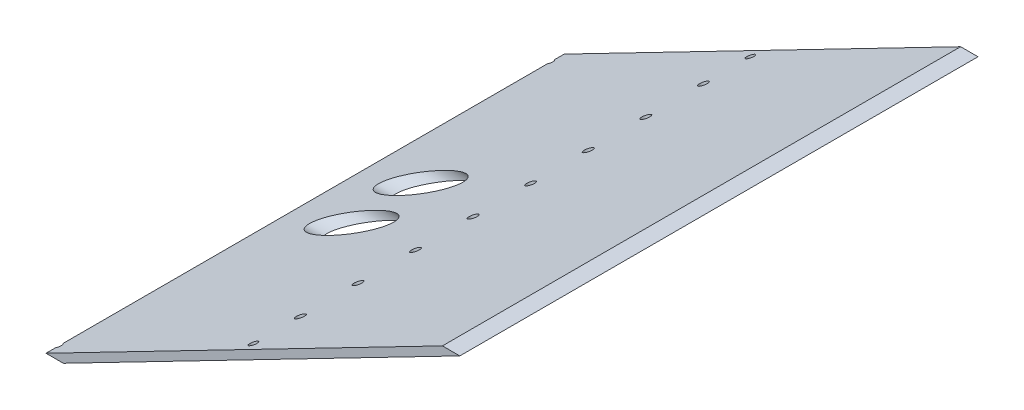
ISO-10303-21;
HEADER;
FILE_DESCRIPTION(('STEP AP214'),'2;1');
FILE_NAME('part.step','',(''),(''),'','','');
FILE_SCHEMA(('AUTOMOTIVE_DESIGN { 1 0 10303 214 1 1 1 1 }'));
ENDSEC;
DATA;
#1=APPLICATION_CONTEXT('core data for automotive mechanical design processes');
#2=APPLICATION_PROTOCOL_DEFINITION('international standard','automotive_design',2000,#1);
#3=PRODUCT_CONTEXT('',#1,'mechanical');
#4=PRODUCT('Part','Part','',(#3));
#5=PRODUCT_RELATED_PRODUCT_CATEGORY('part','',(#4));
#6=PRODUCT_DEFINITION_FORMATION('','',#4);
#7=PRODUCT_DEFINITION_CONTEXT('part definition',#1,'design');
#8=PRODUCT_DEFINITION('design','',#6,#7);
#9=PRODUCT_DEFINITION_SHAPE('','',#8);
#10=(LENGTH_UNIT() NAMED_UNIT(*) SI_UNIT(.MILLI.,.METRE.));
#11=(NAMED_UNIT(*) PLANE_ANGLE_UNIT() SI_UNIT($,.RADIAN.));
#12=(NAMED_UNIT(*) SI_UNIT($,.STERADIAN.) SOLID_ANGLE_UNIT());
#13=UNCERTAINTY_MEASURE_WITH_UNIT(LENGTH_MEASURE(1.E-05),#10,'distance_accuracy_value','');
#14=(GEOMETRIC_REPRESENTATION_CONTEXT(3) GLOBAL_UNCERTAINTY_ASSIGNED_CONTEXT((#13)) GLOBAL_UNIT_ASSIGNED_CONTEXT((#10,
#11,#12)) REPRESENTATION_CONTEXT('',''));
#15=CARTESIAN_POINT('',(0.,0.,0.));
#16=DIRECTION('',(0.,0.,1.));
#17=DIRECTION('',(1.,0.,0.));
#18=AXIS2_PLACEMENT_3D('',#15,#16,#17);
#19=CARTESIAN_POINT('',(5.,0.,5.));
#20=DIRECTION('',(0.,-1.,0.));
#21=DIRECTION('',(0.,0.,-1.));
#22=AXIS2_PLACEMENT_3D('',#19,#20,#21);
#23=CYLINDRICAL_SURFACE('',#22,1.6);
#24=CARTESIAN_POINT('',(5.,3.,5.));
#25=DIRECTION('',(0.,-1.,0.));
#26=DIRECTION('',(0.,0.,-1.));
#27=AXIS2_PLACEMENT_3D('',#24,#25,#26);
#28=CIRCLE('',#27,1.6);
#29=CARTESIAN_POINT('',(5.81249999999997,3.,6.3783481962117));
#30=VERTEX_POINT('',#29);
#31=CARTESIAN_POINT('',(5.81249999999997,3.,3.62165180378831));
#32=VERTEX_POINT('',#31);
#33=EDGE_CURVE('E115',#30,#32,#28,.F.);
#34=ORIENTED_EDGE('',*,*,#33,.F.);
#35=CARTESIAN_POINT('',(5.,2.58064516129034,5.));
#36=DIRECTION('',(0.458642919770252,-0.888620657054864,0.));
#37=DIRECTION('',(-0.888620657054864,-0.458642919770252,0.));
#38=AXIS2_PLACEMENT_3D('',#35,#36,#37);
#39=ELLIPSE('',#38,1.80054333342063,1.6);
#40=EDGE_CURVE('E102',#32,#30,#39,.T.);
#41=ORIENTED_EDGE('',*,*,#40,.F.);
#42=EDGE_LOOP('',(#34,#41));
#43=FACE_BOUND('',#42,.T.);
#44=ADVANCED_FACE('F39',(#43),#23,.F.);
#45=CARTESIAN_POINT('',(5.,0.,190.));
#46=DIRECTION('',(0.,-1.,0.));
#47=DIRECTION('',(0.,0.,-1.));
#48=AXIS2_PLACEMENT_3D('',#45,#46,#47);
#49=CYLINDRICAL_SURFACE('',#48,1.6);
#50=CARTESIAN_POINT('',(5.,3.,190.));
#51=DIRECTION('',(0.,-1.,0.));
#52=DIRECTION('',(0.,0.,-1.));
#53=AXIS2_PLACEMENT_3D('',#50,#51,#52);
#54=CIRCLE('',#53,1.6);
#55=CARTESIAN_POINT('',(5.81249999999997,3.,191.378348196212));
#56=VERTEX_POINT('',#55);
#57=CARTESIAN_POINT('',(5.81249999999997,3.,188.621651803788));
#58=VERTEX_POINT('',#57);
#59=EDGE_CURVE('E97',#56,#58,#54,.F.);
#60=ORIENTED_EDGE('',*,*,#59,.F.);
#61=CARTESIAN_POINT('',(5.,2.58064516129034,190.));
#62=DIRECTION('',(0.458642919770252,-0.888620657054864,0.));
#63=DIRECTION('',(-0.888620657054864,-0.458642919770252,0.));
#64=AXIS2_PLACEMENT_3D('',#61,#62,#63);
#65=ELLIPSE('',#64,1.80054333342063,1.6);
#66=EDGE_CURVE('E93',#58,#56,#65,.T.);
#67=ORIENTED_EDGE('',*,*,#66,.F.);
#68=EDGE_LOOP('',(#60,#67));
#69=FACE_BOUND('',#68,.T.);
#70=ADVANCED_FACE('F95',(#69),#49,.F.);
#71=CARTESIAN_POINT('',(155.,80.,195.));
#72=DIRECTION('',(0.458642919770252,-0.888620657054864,0.));
#73=DIRECTION('',(0.888620657054864,0.458642919770252,0.));
#74=AXIS2_PLACEMENT_3D('',#71,#72,#73);
#75=PLANE('',#74);
#76=CARTESIAN_POINT('',(36.8125,19.,85.));
#77=DIRECTION('',(-0.458642919770252,0.888620657054864,0.));
#78=DIRECTION('',(-0.888620657054864,-0.458642919770252,0.));
#79=AXIS2_PLACEMENT_3D('',#76,#77,#78);
#80=ELLIPSE('',#79,17.8788326310752,8.2);
#81=CARTESIAN_POINT('',(20.925,10.8,85.));
#82=VERTEX_POINT('',#81);
#83=EDGE_CURVE('E129',#82,#82,#80,.T.);
#84=ORIENTED_EDGE('',*,*,#83,.F.);
#85=EDGE_LOOP('',(#84));
#86=FACE_BOUND('',#85,.T.);
#87=CARTESIAN_POINT('',(36.8125,19.,111.));
#88=DIRECTION('',(-0.458642919770252,0.888620657054864,0.));
#89=DIRECTION('',(-0.888620657054864,-0.458642919770252,0.));
#90=AXIS2_PLACEMENT_3D('',#87,#88,#89);
#91=ELLIPSE('',#90,17.8788326310752,8.2);
#92=CARTESIAN_POINT('',(20.925,10.8,111.));
#93=VERTEX_POINT('',#92);
#94=EDGE_CURVE('E150',#93,#93,#91,.T.);
#95=ORIENTED_EDGE('',*,*,#94,.F.);
#96=EDGE_LOOP('',(#95));
#97=FACE_BOUND('',#96,.T.);
#98=CARTESIAN_POINT('',(79.8666442800195,41.2214938219455,21.6666666667));
#99=DIRECTION('',(-0.458642919770252,0.888620657054864,0.));
#100=DIRECTION('',(-0.888620657054864,-0.458642919770252,0.));
#101=AXIS2_PLACEMENT_3D('',#98,#99,#100);
#102=CIRCLE('',#101,1.70000000000001);
#103=CARTESIAN_POINT('',(78.3559891630262,40.4418008583361,21.6666666667));
#104=VERTEX_POINT('',#103);
#105=EDGE_CURVE('E164',#104,#104,#102,.T.);
#106=ORIENTED_EDGE('',*,*,#105,.F.);
#107=EDGE_LOOP('',(#106));
#108=FACE_BOUND('',#107,.T.);
#109=CARTESIAN_POINT('',(79.8666442800195,41.2214938219455,4.));
#110=DIRECTION('',(-0.458642919770252,0.888620657054864,0.));
#111=DIRECTION('',(-0.888620657054864,-0.458642919770252,0.));
#112=AXIS2_PLACEMENT_3D('',#109,#110,#111);
#113=CIRCLE('',#112,1.51999999999999);
#114=CARTESIAN_POINT('',(78.5159408812961,40.5243565838948,4.));
#115=VERTEX_POINT('',#114);
#116=EDGE_CURVE('E184',#115,#115,#113,.T.);
#117=ORIENTED_EDGE('',*,*,#116,.F.);
#118=EDGE_LOOP('',(#117));
#119=FACE_BOUND('',#118,.T.);
#120=CARTESIAN_POINT('',(79.8666442800195,41.2214938219455,86.6666666668));
#121=DIRECTION('',(-0.458642919770252,0.888620657054864,0.));
#122=DIRECTION('',(-0.888620657054864,-0.458642919770252,0.));
#123=AXIS2_PLACEMENT_3D('',#120,#121,#122);
#124=CIRCLE('',#123,1.7);
#125=CARTESIAN_POINT('',(78.3559891630262,40.4418008583361,86.6666666668));
#126=VERTEX_POINT('',#125);
#127=EDGE_CURVE('E173',#126,#126,#124,.T.);
#128=ORIENTED_EDGE('',*,*,#127,.F.);
#129=EDGE_LOOP('',(#128));
#130=FACE_BOUND('',#129,.T.);
#131=CARTESIAN_POINT('',(79.8666442800195,41.2214938219455,65.0000000001));
#132=DIRECTION('',(-0.458642919770252,0.888620657054864,0.));
#133=DIRECTION('',(-0.888620657054864,-0.458642919770252,0.));
#134=AXIS2_PLACEMENT_3D('',#131,#132,#133);
#135=CIRCLE('',#134,1.7);
#136=CARTESIAN_POINT('',(78.3559891630262,40.4418008583361,65.0000000001));
#137=VERTEX_POINT('',#136);
#138=EDGE_CURVE('E174',#137,#137,#135,.T.);
#139=ORIENTED_EDGE('',*,*,#138,.F.);
#140=EDGE_LOOP('',(#139));
#141=FACE_BOUND('',#140,.T.);
#142=CARTESIAN_POINT('',(79.8666442800195,41.2214938219455,43.3333333334));
#143=DIRECTION('',(-0.458642919770252,0.888620657054864,0.));
#144=DIRECTION('',(-0.888620657054864,-0.458642919770252,0.));
#145=AXIS2_PLACEMENT_3D('',#142,#143,#144);
#146=CIRCLE('',#145,1.70000000000001);
#147=CARTESIAN_POINT('',(78.3559891630262,40.4418008583361,43.3333333334));
#148=VERTEX_POINT('',#147);
#149=EDGE_CURVE('E167',#148,#148,#146,.T.);
#150=ORIENTED_EDGE('',*,*,#149,.F.);
#151=EDGE_LOOP('',(#150));
#152=FACE_BOUND('',#151,.T.);
#153=CARTESIAN_POINT('',(79.8666442800195,41.2214938219455,173.3333333333));
#154=DIRECTION('',(0.458642919770252,-0.888620657054864,0.));
#155=DIRECTION('',(-0.888620657054864,-0.458642919770252,0.));
#156=AXIS2_PLACEMENT_3D('',#153,#154,#155);
#157=CIRCLE('',#156,1.70000000000001);
#158=CARTESIAN_POINT('',(78.3559891630262,40.4418008583361,173.3333333333));
#159=VERTEX_POINT('',#158);
#160=EDGE_CURVE('E193',#159,#159,#157,.T.);
#161=ORIENTED_EDGE('',*,*,#160,.T.);
#162=EDGE_LOOP('',(#161));
#163=FACE_BOUND('',#162,.T.);
#164=CARTESIAN_POINT('',(79.8666442800195,41.2214938219455,191.));
#165=DIRECTION('',(0.458642919770252,-0.888620657054864,0.));
#166=DIRECTION('',(-0.888620657054864,-0.458642919770252,0.));
#167=AXIS2_PLACEMENT_3D('',#164,#165,#166);
#168=CIRCLE('',#167,1.51999999999999);
#169=CARTESIAN_POINT('',(78.5159408812961,40.5243565838948,191.));
#170=VERTEX_POINT('',#169);
#171=EDGE_CURVE('E133',#170,#170,#168,.T.);
#172=ORIENTED_EDGE('',*,*,#171,.T.);
#173=EDGE_LOOP('',(#172));
#174=FACE_BOUND('',#173,.T.);
#175=CARTESIAN_POINT('',(79.8666442800195,41.2214938219455,108.3333333332));
#176=DIRECTION('',(0.458642919770252,-0.888620657054864,0.));
#177=DIRECTION('',(-0.888620657054864,-0.458642919770252,0.));
#178=AXIS2_PLACEMENT_3D('',#175,#176,#177);
#179=CIRCLE('',#178,1.7);
#180=CARTESIAN_POINT('',(78.3559891630262,40.4418008583361,108.3333333332));
#181=VERTEX_POINT('',#180);
#182=EDGE_CURVE('E216',#181,#181,#179,.T.);
#183=ORIENTED_EDGE('',*,*,#182,.T.);
#184=EDGE_LOOP('',(#183));
#185=FACE_BOUND('',#184,.T.);
#186=CARTESIAN_POINT('',(79.8666442800195,41.2214938219455,129.9999999999));
#187=DIRECTION('',(0.458642919770252,-0.888620657054864,0.));
#188=DIRECTION('',(-0.888620657054864,-0.458642919770252,0.));
#189=AXIS2_PLACEMENT_3D('',#186,#187,#188);
#190=CIRCLE('',#189,1.7);
#191=CARTESIAN_POINT('',(78.3559891630262,40.4418008583361,129.9999999999));
#192=VERTEX_POINT('',#191);
#193=EDGE_CURVE('E199',#192,#192,#190,.T.);
#194=ORIENTED_EDGE('',*,*,#193,.T.);
#195=EDGE_LOOP('',(#194));
#196=FACE_BOUND('',#195,.T.);
#197=CARTESIAN_POINT('',(79.8666442800195,41.2214938219455,151.6666666666));
#198=DIRECTION('',(0.458642919770252,-0.888620657054864,0.));
#199=DIRECTION('',(-0.888620657054864,-0.458642919770252,0.));
#200=AXIS2_PLACEMENT_3D('',#197,#198,#199);
#201=CIRCLE('',#200,1.70000000000001);
#202=CARTESIAN_POINT('',(78.3559891630262,40.4418008583361,151.6666666666));
#203=VERTEX_POINT('',#202);
#204=EDGE_CURVE('E206',#203,#203,#201,.T.);
#205=ORIENTED_EDGE('',*,*,#204,.T.);
#206=EDGE_LOOP('',(#205));
#207=FACE_BOUND('',#206,.T.);
#208=DIRECTION('',(0.,0.,-1.));
#209=VECTOR('',#208,1.);
#210=CARTESIAN_POINT('',(5.8125,3.,195.));
#211=LINE('',#210,#209);
#212=CARTESIAN_POINT('',(5.8125,3.,195.));
#213=VERTEX_POINT('',#212);
#214=EDGE_CURVE('E111',#213,#56,#211,.T.);
#215=ORIENTED_EDGE('',*,*,#214,.F.);
#216=DIRECTION('',(-0.888620657054864,-0.458642919770252,0.));
#217=VECTOR('',#216,1.);
#218=CARTESIAN_POINT('',(155.,80.,195.));
#219=LINE('',#218,#217);
#220=CARTESIAN_POINT('',(155.,80.,195.));
#221=VERTEX_POINT('',#220);
#222=EDGE_CURVE('E120',#221,#213,#219,.T.);
#223=ORIENTED_EDGE('',*,*,#222,.F.);
#224=DIRECTION('',(0.,0.,-1.));
#225=VECTOR('',#224,1.);
#226=CARTESIAN_POINT('',(155.,80.,195.));
#227=LINE('',#226,#225);
#228=CARTESIAN_POINT('',(155.,80.,0.));
#229=VERTEX_POINT('',#228);
#230=EDGE_CURVE('E157',#221,#229,#227,.T.);
#231=ORIENTED_EDGE('',*,*,#230,.T.);
#232=DIRECTION('',(-0.888620657054864,-0.458642919770252,0.));
#233=VECTOR('',#232,1.);
#234=CARTESIAN_POINT('',(155.,80.,0.));
#235=LINE('',#234,#233);
#236=CARTESIAN_POINT('',(5.8125,3.,0.));
#237=VERTEX_POINT('',#236);
#238=EDGE_CURVE('E130',#229,#237,#235,.T.);
#239=ORIENTED_EDGE('',*,*,#238,.T.);
#240=EDGE_CURVE('E112',#32,#237,#211,.T.);
#241=ORIENTED_EDGE('',*,*,#240,.F.);
#242=ORIENTED_EDGE('',*,*,#40,.T.);
#243=EDGE_CURVE('E105',#58,#30,#211,.T.);
#244=ORIENTED_EDGE('',*,*,#243,.F.);
#245=ORIENTED_EDGE('',*,*,#66,.T.);
#246=EDGE_LOOP('',(#215,#223,#231,#239,#241,#242,#244,#245));
#247=FACE_BOUND('',#246,.T.);
#248=ADVANCED_FACE('F106',(#86,#97,#108,#119,#130,#141,#152,#163,#174,#185,#196,#207,#247),#75,.F.);
#249=CARTESIAN_POINT('',(195.,80.,195.));
#250=DIRECTION('',(0.,-1.,0.));
#251=DIRECTION('',(1.,0.,0.));
#252=AXIS2_PLACEMENT_3D('',#249,#250,#251);
#253=PLANE('',#252);
#254=DIRECTION('',(-1.,0.,0.));
#255=VECTOR('',#254,1.);
#256=CARTESIAN_POINT('',(195.,80.,195.));
#257=LINE('',#256,#255);
#258=CARTESIAN_POINT('',(161.541036328442,80.0000000000001,195.));
#259=VERTEX_POINT('',#258);
#260=EDGE_CURVE('E160',#259,#221,#257,.T.);
#261=ORIENTED_EDGE('',*,*,#260,.F.);
#262=DIRECTION('',(0.,0.,-1.));
#263=VECTOR('',#262,1.);
#264=CARTESIAN_POINT('',(161.541036328442,80.,195.));
#265=LINE('',#264,#263);
#266=CARTESIAN_POINT('',(161.541036328442,80.0000000000001,0.));
#267=VERTEX_POINT('',#266);
#268=EDGE_CURVE('E63',#259,#267,#265,.T.);
#269=ORIENTED_EDGE('',*,*,#268,.T.);
#270=DIRECTION('',(-1.,0.,0.));
#271=VECTOR('',#270,1.);
#272=CARTESIAN_POINT('',(195.,80.,0.));
#273=LINE('',#272,#271);
#274=EDGE_CURVE('E161',#267,#229,#273,.T.);
#275=ORIENTED_EDGE('',*,*,#274,.T.);
#276=ORIENTED_EDGE('',*,*,#230,.F.);
#277=EDGE_LOOP('',(#261,#269,#275,#276));
#278=FACE_BOUND('',#277,.T.);
#279=ADVANCED_FACE('F247',(#278),#253,.F.);
#280=CARTESIAN_POINT('',(0.,3.,0.));
#281=DIRECTION('',(0.,-1.,0.));
#282=DIRECTION('',(0.,0.,-1.));
#283=AXIS2_PLACEMENT_3D('',#280,#281,#282);
#284=PLANE('',#283);
#285=DIRECTION('',(0.,0.,-1.));
#286=VECTOR('',#285,1.);
#287=CARTESIAN_POINT('',(12.3535363284421,3.,195.));
#288=LINE('',#287,#286);
#289=CARTESIAN_POINT('',(12.3535363284421,3.,195.));
#290=VERTEX_POINT('',#289);
#291=CARTESIAN_POINT('',(12.3535363284421,3.,0.));
#292=VERTEX_POINT('',#291);
#293=EDGE_CURVE('E55',#290,#292,#288,.T.);
#294=ORIENTED_EDGE('',*,*,#293,.F.);
#295=DIRECTION('',(-1.,0.,0.));
#296=VECTOR('',#295,1.);
#297=CARTESIAN_POINT('',(0.,3.,195.));
#298=LINE('',#297,#296);
#299=EDGE_CURVE('E117',#290,#213,#298,.T.);
#300=ORIENTED_EDGE('',*,*,#299,.T.);
#301=ORIENTED_EDGE('',*,*,#214,.T.);
#302=ORIENTED_EDGE('',*,*,#59,.T.);
#303=ORIENTED_EDGE('',*,*,#243,.T.);
#304=ORIENTED_EDGE('',*,*,#33,.T.);
#305=ORIENTED_EDGE('',*,*,#240,.T.);
#306=DIRECTION('',(-1.,0.,0.));
#307=VECTOR('',#306,1.);
#308=CARTESIAN_POINT('',(0.,3.,0.));
#309=LINE('',#308,#307);
#310=EDGE_CURVE('E125',#292,#237,#309,.T.);
#311=ORIENTED_EDGE('',*,*,#310,.F.);
#312=EDGE_LOOP('',(#294,#300,#301,#302,#303,#304,#305,#311));
#313=FACE_BOUND('',#312,.T.);
#314=ADVANCED_FACE('F114',(#313),#284,.T.);
#315=CARTESIAN_POINT('',(0.,0.,195.));
#316=DIRECTION('',(0.,0.,-1.));
#317=DIRECTION('',(-1.,0.,0.));
#318=AXIS2_PLACEMENT_3D('',#315,#316,#317);
#319=PLANE('',#318);
#320=ORIENTED_EDGE('',*,*,#299,.F.);
#321=DIRECTION('',(0.888620657054864,0.458642919770252,0.));
#322=VECTOR('',#321,1.);
#323=CARTESIAN_POINT('',(1.37592875931075,-2.66586197116458,195.));
#324=LINE('',#323,#322);
#325=EDGE_CURVE('E131',#290,#259,#324,.T.);
#326=ORIENTED_EDGE('',*,*,#325,.T.);
#327=ORIENTED_EDGE('',*,*,#260,.T.);
#328=ORIENTED_EDGE('',*,*,#222,.T.);
#329=EDGE_LOOP('',(#320,#326,#327,#328));
#330=FACE_BOUND('',#329,.T.);
#331=ADVANCED_FACE('F287',(#330),#319,.F.);
#332=CARTESIAN_POINT('',(0.,0.,0.));
#333=DIRECTION('',(0.,0.,-1.));
#334=DIRECTION('',(-1.,0.,0.));
#335=AXIS2_PLACEMENT_3D('',#332,#333,#334);
#336=PLANE('',#335);
#337=DIRECTION('',(0.888620657054864,0.458642919770252,0.));
#338=VECTOR('',#337,1.);
#339=CARTESIAN_POINT('',(1.37592875931075,-2.66586197116458,0.));
#340=LINE('',#339,#338);
#341=EDGE_CURVE('E11',#292,#267,#340,.T.);
#342=ORIENTED_EDGE('',*,*,#341,.F.);
#343=ORIENTED_EDGE('',*,*,#310,.T.);
#344=ORIENTED_EDGE('',*,*,#238,.F.);
#345=ORIENTED_EDGE('',*,*,#274,.F.);
#346=EDGE_LOOP('',(#342,#343,#344,#345));
#347=FACE_BOUND('',#346,.T.);
#348=ADVANCED_FACE('F41',(#347),#336,.T.);
#349=CARTESIAN_POINT('',(61.,19.,85.));
#350=DIRECTION('',(-1.,0.,0.));
#351=DIRECTION('',(0.,0.,1.));
#352=AXIS2_PLACEMENT_3D('',#349,#350,#351);
#353=CYLINDRICAL_SURFACE('',#352,8.2);
#354=CARTESIAN_POINT('',(43.3535363284421,19.,85.));
#355=DIRECTION('',(-0.458642919770252,0.888620657054864,0.));
#356=DIRECTION('',(-0.888620657054864,-0.458642919770252,0.));
#357=AXIS2_PLACEMENT_3D('',#354,#355,#356);
#358=ELLIPSE('',#357,17.8788326310752,8.2);
#359=CARTESIAN_POINT('',(27.4660363284421,10.8,85.));
#360=VERTEX_POINT('',#359);
#361=EDGE_CURVE('E48',#360,#360,#358,.T.);
#362=ORIENTED_EDGE('',*,*,#361,.F.);
#363=EDGE_LOOP('',(#362));
#364=FACE_BOUND('',#363,.T.);
#365=ORIENTED_EDGE('',*,*,#83,.T.);
#366=EDGE_LOOP('',(#365));
#367=FACE_BOUND('',#366,.T.);
#368=ADVANCED_FACE('F146',(#364,#367),#353,.F.);
#369=CARTESIAN_POINT('',(61.,19.,111.));
#370=DIRECTION('',(-1.,0.,0.));
#371=DIRECTION('',(0.,0.,1.));
#372=AXIS2_PLACEMENT_3D('',#369,#370,#371);
#373=CYLINDRICAL_SURFACE('',#372,8.2);
#374=CARTESIAN_POINT('',(43.3535363284421,19.,111.));
#375=DIRECTION('',(-0.458642919770252,0.888620657054864,0.));
#376=DIRECTION('',(-0.888620657054864,-0.458642919770252,0.));
#377=AXIS2_PLACEMENT_3D('',#374,#375,#376);
#378=ELLIPSE('',#377,17.8788326310752,8.2);
#379=CARTESIAN_POINT('',(27.4660363284421,10.8,111.));
#380=VERTEX_POINT('',#379);
#381=EDGE_CURVE('E43',#380,#380,#378,.T.);
#382=ORIENTED_EDGE('',*,*,#381,.F.);
#383=EDGE_LOOP('',(#382));
#384=FACE_BOUND('',#383,.T.);
#385=ORIENTED_EDGE('',*,*,#94,.T.);
#386=EDGE_LOOP('',(#385));
#387=FACE_BOUND('',#386,.T.);
#388=ADVANCED_FACE('F142',(#384,#387),#373,.F.);
#389=CARTESIAN_POINT('',(81.2425730393302,38.555631850781,21.6666666667));
#390=DIRECTION('',(-0.458642919770252,0.888620657054864,0.));
#391=DIRECTION('',(-0.888620657054864,-0.458642919770252,0.));
#392=AXIS2_PLACEMENT_3D('',#389,#390,#391);
#393=CYLINDRICAL_SURFACE('',#392,1.70000000000001);
#394=CARTESIAN_POINT('',(81.2425730393302,38.555631850781,21.6666666667));
#395=DIRECTION('',(-0.458642919770252,0.888620657054864,0.));
#396=DIRECTION('',(-0.888620657054864,-0.458642919770252,0.));
#397=AXIS2_PLACEMENT_3D('',#394,#395,#396);
#398=CIRCLE('',#397,1.70000000000001);
#399=CARTESIAN_POINT('',(79.731917922337,37.7759388871715,21.6666666667));
#400=VERTEX_POINT('',#399);
#401=EDGE_CURVE('E101',#400,#400,#398,.T.);
#402=ORIENTED_EDGE('',*,*,#401,.F.);
#403=EDGE_LOOP('',(#402));
#404=FACE_BOUND('',#403,.T.);
#405=ORIENTED_EDGE('',*,*,#105,.T.);
#406=EDGE_LOOP('',(#405));
#407=FACE_BOUND('',#406,.T.);
#408=ADVANCED_FACE('F145',(#404,#407),#393,.F.);
#409=CARTESIAN_POINT('',(81.2425730393302,38.555631850781,4.));
#410=DIRECTION('',(-0.458642919770252,0.888620657054864,0.));
#411=DIRECTION('',(-0.888620657054864,-0.458642919770252,0.));
#412=AXIS2_PLACEMENT_3D('',#409,#410,#411);
#413=CYLINDRICAL_SURFACE('',#412,1.51999999999999);
#414=CARTESIAN_POINT('',(81.2425730393302,38.555631850781,4.));
#415=DIRECTION('',(-0.458642919770252,0.888620657054864,0.));
#416=DIRECTION('',(-0.888620657054864,-0.458642919770252,0.));
#417=AXIS2_PLACEMENT_3D('',#414,#415,#416);
#418=CIRCLE('',#417,1.51999999999999);
#419=CARTESIAN_POINT('',(79.8918696406069,37.8584946127302,4.));
#420=VERTEX_POINT('',#419);
#421=EDGE_CURVE('E127',#420,#420,#418,.T.);
#422=ORIENTED_EDGE('',*,*,#421,.F.);
#423=EDGE_LOOP('',(#422));
#424=FACE_BOUND('',#423,.T.);
#425=ORIENTED_EDGE('',*,*,#116,.T.);
#426=EDGE_LOOP('',(#425));
#427=FACE_BOUND('',#426,.T.);
#428=ADVANCED_FACE('F253',(#424,#427),#413,.F.);
#429=CARTESIAN_POINT('',(81.2425730393302,38.555631850781,86.6666666668));
#430=DIRECTION('',(-0.458642919770252,0.888620657054864,0.));
#431=DIRECTION('',(-0.888620657054864,-0.458642919770252,0.));
#432=AXIS2_PLACEMENT_3D('',#429,#430,#431);
#433=CYLINDRICAL_SURFACE('',#432,1.7);
#434=CARTESIAN_POINT('',(81.2425730393302,38.555631850781,86.6666666668));
#435=DIRECTION('',(-0.458642919770252,0.888620657054864,0.));
#436=DIRECTION('',(-0.888620657054864,-0.458642919770252,0.));
#437=AXIS2_PLACEMENT_3D('',#434,#435,#436);
#438=CIRCLE('',#437,1.7);
#439=CARTESIAN_POINT('',(79.731917922337,37.7759388871715,86.6666666668));
#440=VERTEX_POINT('',#439);
#441=EDGE_CURVE('E188',#440,#440,#438,.T.);
#442=ORIENTED_EDGE('',*,*,#441,.F.);
#443=EDGE_LOOP('',(#442));
#444=FACE_BOUND('',#443,.T.);
#445=ORIENTED_EDGE('',*,*,#127,.T.);
#446=EDGE_LOOP('',(#445));
#447=FACE_BOUND('',#446,.T.);
#448=ADVANCED_FACE('F259',(#444,#447),#433,.F.);
#449=CARTESIAN_POINT('',(81.2425730393302,38.555631850781,65.0000000001));
#450=DIRECTION('',(-0.458642919770252,0.888620657054864,0.));
#451=DIRECTION('',(-0.888620657054864,-0.458642919770252,0.));
#452=AXIS2_PLACEMENT_3D('',#449,#450,#451);
#453=CYLINDRICAL_SURFACE('',#452,1.7);
#454=CARTESIAN_POINT('',(81.2425730393302,38.555631850781,65.0000000001));
#455=DIRECTION('',(-0.458642919770252,0.888620657054864,0.));
#456=DIRECTION('',(-0.888620657054864,-0.458642919770252,0.));
#457=AXIS2_PLACEMENT_3D('',#454,#455,#456);
#458=CIRCLE('',#457,1.7);
#459=CARTESIAN_POINT('',(79.731917922337,37.7759388871715,65.0000000001));
#460=VERTEX_POINT('',#459);
#461=EDGE_CURVE('E170',#460,#460,#458,.T.);
#462=ORIENTED_EDGE('',*,*,#461,.F.);
#463=EDGE_LOOP('',(#462));
#464=FACE_BOUND('',#463,.T.);
#465=ORIENTED_EDGE('',*,*,#138,.T.);
#466=EDGE_LOOP('',(#465));
#467=FACE_BOUND('',#466,.T.);
#468=ADVANCED_FACE('F255',(#464,#467),#453,.F.);
#469=CARTESIAN_POINT('',(81.2425730393302,38.555631850781,43.3333333334));
#470=DIRECTION('',(-0.458642919770252,0.888620657054864,0.));
#471=DIRECTION('',(-0.888620657054864,-0.458642919770252,0.));
#472=AXIS2_PLACEMENT_3D('',#469,#470,#471);
#473=CYLINDRICAL_SURFACE('',#472,1.70000000000001);
#474=CARTESIAN_POINT('',(81.2425730393302,38.555631850781,43.3333333334));
#475=DIRECTION('',(-0.458642919770252,0.888620657054864,0.));
#476=DIRECTION('',(-0.888620657054864,-0.458642919770252,0.));
#477=AXIS2_PLACEMENT_3D('',#474,#475,#476);
#478=CIRCLE('',#477,1.70000000000001);
#479=CARTESIAN_POINT('',(79.731917922337,37.7759388871715,43.3333333334));
#480=VERTEX_POINT('',#479);
#481=EDGE_CURVE('E177',#480,#480,#478,.T.);
#482=ORIENTED_EDGE('',*,*,#481,.F.);
#483=EDGE_LOOP('',(#482));
#484=FACE_BOUND('',#483,.T.);
#485=ORIENTED_EDGE('',*,*,#149,.T.);
#486=EDGE_LOOP('',(#485));
#487=FACE_BOUND('',#486,.T.);
#488=ADVANCED_FACE('F258',(#484,#487),#473,.F.);
#489=CARTESIAN_POINT('',(81.2425730393302,38.555631850781,173.3333333333));
#490=DIRECTION('',(-0.458642919770252,0.888620657054864,0.));
#491=DIRECTION('',(-0.888620657054864,-0.458642919770252,0.));
#492=AXIS2_PLACEMENT_3D('',#489,#490,#491);
#493=CYLINDRICAL_SURFACE('',#492,1.70000000000001);
#494=CARTESIAN_POINT('',(81.2425730393302,38.555631850781,173.3333333333));
#495=DIRECTION('',(0.458642919770252,-0.888620657054864,0.));
#496=DIRECTION('',(-0.888620657054864,-0.458642919770252,0.));
#497=AXIS2_PLACEMENT_3D('',#494,#495,#496);
#498=CIRCLE('',#497,1.70000000000001);
#499=CARTESIAN_POINT('',(79.731917922337,37.7759388871715,173.3333333333));
#500=VERTEX_POINT('',#499);
#501=EDGE_CURVE('E187',#500,#500,#498,.T.);
#502=ORIENTED_EDGE('',*,*,#501,.T.);
#503=EDGE_LOOP('',(#502));
#504=FACE_BOUND('',#503,.T.);
#505=ORIENTED_EDGE('',*,*,#160,.F.);
#506=EDGE_LOOP('',(#505));
#507=FACE_BOUND('',#506,.T.);
#508=ADVANCED_FACE('F263',(#504,#507),#493,.F.);
#509=CARTESIAN_POINT('',(81.2425730393302,38.555631850781,191.));
#510=DIRECTION('',(-0.458642919770252,0.888620657054864,0.));
#511=DIRECTION('',(-0.888620657054864,-0.458642919770252,0.));
#512=AXIS2_PLACEMENT_3D('',#509,#510,#511);
#513=CYLINDRICAL_SURFACE('',#512,1.51999999999999);
#514=CARTESIAN_POINT('',(81.2425730393302,38.555631850781,191.));
#515=DIRECTION('',(0.458642919770252,-0.888620657054864,0.));
#516=DIRECTION('',(-0.888620657054864,-0.458642919770252,0.));
#517=AXIS2_PLACEMENT_3D('',#514,#515,#516);
#518=CIRCLE('',#517,1.51999999999999);
#519=CARTESIAN_POINT('',(79.8918696406069,37.8584946127302,191.));
#520=VERTEX_POINT('',#519);
#521=EDGE_CURVE('E213',#520,#520,#518,.T.);
#522=ORIENTED_EDGE('',*,*,#521,.T.);
#523=EDGE_LOOP('',(#522));
#524=FACE_BOUND('',#523,.T.);
#525=ORIENTED_EDGE('',*,*,#171,.F.);
#526=EDGE_LOOP('',(#525));
#527=FACE_BOUND('',#526,.T.);
#528=ADVANCED_FACE('F273',(#524,#527),#513,.F.);
#529=CARTESIAN_POINT('',(81.2425730393302,38.555631850781,108.3333333332));
#530=DIRECTION('',(-0.458642919770252,0.888620657054864,0.));
#531=DIRECTION('',(-0.888620657054864,-0.458642919770252,0.));
#532=AXIS2_PLACEMENT_3D('',#529,#530,#531);
#533=CYLINDRICAL_SURFACE('',#532,1.7);
#534=CARTESIAN_POINT('',(81.2425730393302,38.555631850781,108.3333333332));
#535=DIRECTION('',(0.458642919770252,-0.888620657054864,0.));
#536=DIRECTION('',(-0.888620657054864,-0.458642919770252,0.));
#537=AXIS2_PLACEMENT_3D('',#534,#535,#536);
#538=CIRCLE('',#537,1.7);
#539=CARTESIAN_POINT('',(79.731917922337,37.7759388871715,108.3333333332));
#540=VERTEX_POINT('',#539);
#541=EDGE_CURVE('E202',#540,#540,#538,.T.);
#542=ORIENTED_EDGE('',*,*,#541,.T.);
#543=EDGE_LOOP('',(#542));
#544=FACE_BOUND('',#543,.T.);
#545=ORIENTED_EDGE('',*,*,#182,.F.);
#546=EDGE_LOOP('',(#545));
#547=FACE_BOUND('',#546,.T.);
#548=ADVANCED_FACE('F276',(#544,#547),#533,.F.);
#549=CARTESIAN_POINT('',(81.2425730393302,38.555631850781,129.9999999999));
#550=DIRECTION('',(-0.458642919770252,0.888620657054864,0.));
#551=DIRECTION('',(-0.888620657054864,-0.458642919770252,0.));
#552=AXIS2_PLACEMENT_3D('',#549,#550,#551);
#553=CYLINDRICAL_SURFACE('',#552,1.7);
#554=CARTESIAN_POINT('',(81.2425730393302,38.555631850781,129.9999999999));
#555=DIRECTION('',(0.458642919770252,-0.888620657054864,0.));
#556=DIRECTION('',(-0.888620657054864,-0.458642919770252,0.));
#557=AXIS2_PLACEMENT_3D('',#554,#555,#556);
#558=CIRCLE('',#557,1.7);
#559=CARTESIAN_POINT('',(79.731917922337,37.7759388871715,129.9999999999));
#560=VERTEX_POINT('',#559);
#561=EDGE_CURVE('E203',#560,#560,#558,.T.);
#562=ORIENTED_EDGE('',*,*,#561,.T.);
#563=EDGE_LOOP('',(#562));
#564=FACE_BOUND('',#563,.T.);
#565=ORIENTED_EDGE('',*,*,#193,.F.);
#566=EDGE_LOOP('',(#565));
#567=FACE_BOUND('',#566,.T.);
#568=ADVANCED_FACE('F241',(#564,#567),#553,.F.);
#569=CARTESIAN_POINT('',(81.2425730393302,38.555631850781,151.6666666666));
#570=DIRECTION('',(-0.458642919770252,0.888620657054864,0.));
#571=DIRECTION('',(-0.888620657054864,-0.458642919770252,0.));
#572=AXIS2_PLACEMENT_3D('',#569,#570,#571);
#573=CYLINDRICAL_SURFACE('',#572,1.70000000000001);
#574=CARTESIAN_POINT('',(81.2425730393302,38.555631850781,151.6666666666));
#575=DIRECTION('',(0.458642919770252,-0.888620657054864,0.));
#576=DIRECTION('',(-0.888620657054864,-0.458642919770252,0.));
#577=AXIS2_PLACEMENT_3D('',#574,#575,#576);
#578=CIRCLE('',#577,1.70000000000001);
#579=CARTESIAN_POINT('',(79.731917922337,37.7759388871715,151.6666666666));
#580=VERTEX_POINT('',#579);
#581=EDGE_CURVE('E196',#580,#580,#578,.T.);
#582=ORIENTED_EDGE('',*,*,#581,.T.);
#583=EDGE_LOOP('',(#582));
#584=FACE_BOUND('',#583,.T.);
#585=ORIENTED_EDGE('',*,*,#204,.F.);
#586=EDGE_LOOP('',(#585));
#587=FACE_BOUND('',#586,.T.);
#588=ADVANCED_FACE('F235',(#584,#587),#573,.F.);
#589=CARTESIAN_POINT('',(156.375928759311,77.3341380288354,195.));
#590=DIRECTION('',(0.458642919770252,-0.888620657054864,0.));
#591=DIRECTION('',(0.888620657054864,0.458642919770252,0.));
#592=AXIS2_PLACEMENT_3D('',#589,#590,#591);
#593=PLANE('',#592);
#594=ORIENTED_EDGE('',*,*,#521,.F.);
#595=EDGE_LOOP('',(#594));
#596=FACE_BOUND('',#595,.T.);
#597=ORIENTED_EDGE('',*,*,#325,.F.);
#598=ORIENTED_EDGE('',*,*,#293,.T.);
#599=ORIENTED_EDGE('',*,*,#341,.T.);
#600=ORIENTED_EDGE('',*,*,#268,.F.);
#601=EDGE_LOOP('',(#597,#598,#599,#600));
#602=FACE_BOUND('',#601,.T.);
#603=ORIENTED_EDGE('',*,*,#421,.T.);
#604=EDGE_LOOP('',(#603));
#605=FACE_BOUND('',#604,.T.);
#606=ORIENTED_EDGE('',*,*,#581,.F.);
#607=EDGE_LOOP('',(#606));
#608=FACE_BOUND('',#607,.T.);
#609=ORIENTED_EDGE('',*,*,#561,.F.);
#610=EDGE_LOOP('',(#609));
#611=FACE_BOUND('',#610,.T.);
#612=ORIENTED_EDGE('',*,*,#541,.F.);
#613=EDGE_LOOP('',(#612));
#614=FACE_BOUND('',#613,.T.);
#615=ORIENTED_EDGE('',*,*,#501,.F.);
#616=EDGE_LOOP('',(#615));
#617=FACE_BOUND('',#616,.T.);
#618=ORIENTED_EDGE('',*,*,#481,.T.);
#619=EDGE_LOOP('',(#618));
#620=FACE_BOUND('',#619,.T.);
#621=ORIENTED_EDGE('',*,*,#461,.T.);
#622=EDGE_LOOP('',(#621));
#623=FACE_BOUND('',#622,.T.);
#624=ORIENTED_EDGE('',*,*,#441,.T.);
#625=EDGE_LOOP('',(#624));
#626=FACE_BOUND('',#625,.T.);
#627=ORIENTED_EDGE('',*,*,#401,.T.);
#628=EDGE_LOOP('',(#627));
#629=FACE_BOUND('',#628,.T.);
#630=ORIENTED_EDGE('',*,*,#381,.T.);
#631=EDGE_LOOP('',(#630));
#632=FACE_BOUND('',#631,.T.);
#633=ORIENTED_EDGE('',*,*,#361,.T.);
#634=EDGE_LOOP('',(#633));
#635=FACE_BOUND('',#634,.T.);
#636=ADVANCED_FACE('F140',(#596,#602,#605,#608,#611,#614,#617,#620,#623,#626,#629,#632,#635),
#593,.T.);
#637=CLOSED_SHELL('',(#44,#70,#248,#279,#314,#331,#348,#368,#388,#408,#428,#448,#468,#488,#508,
#528,#548,#568,#588,#636));
#638=MANIFOLD_SOLID_BREP('B2',#637);
#639=ADVANCED_BREP_SHAPE_REPRESENTATION('',(#18,#638),#14);
#640=SHAPE_DEFINITION_REPRESENTATION(#9,#639);
ENDSEC;
END-ISO-10303-21;
